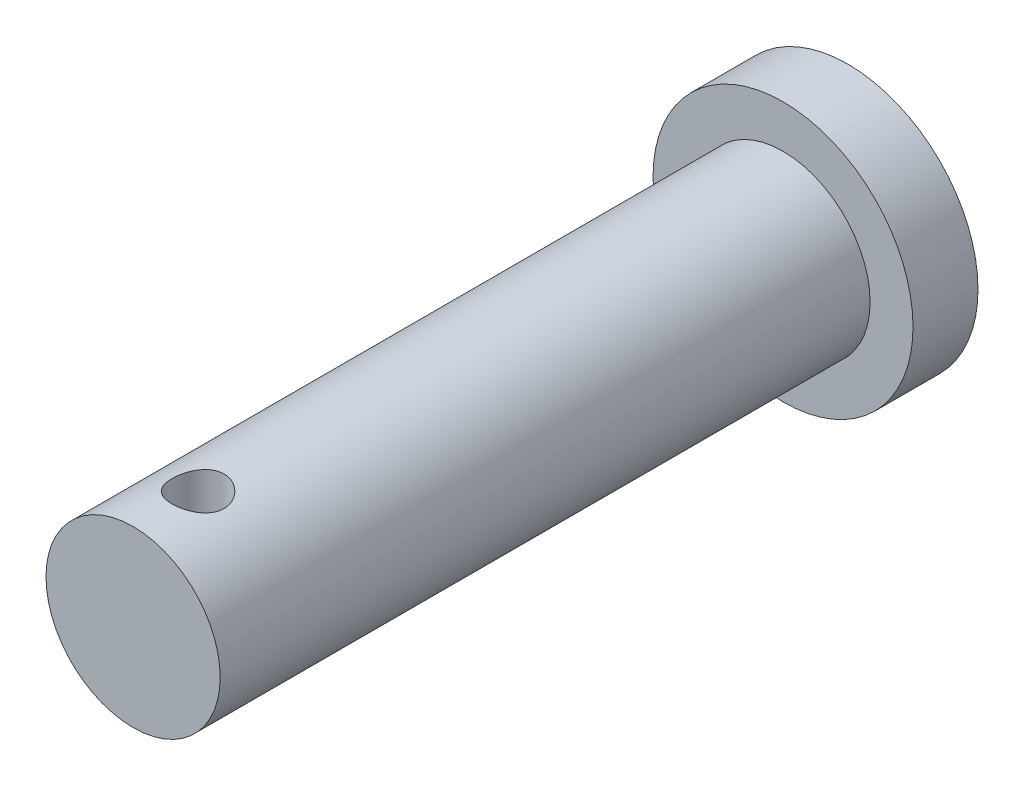
ISO-10303-21;
HEADER;
FILE_DESCRIPTION(('STEP AP214'),'2;1');
FILE_NAME('part.step','',(''),(''),'','','');
FILE_SCHEMA(('AUTOMOTIVE_DESIGN { 1 0 10303 214 1 1 1 1 }'));
ENDSEC;
DATA;
#1=APPLICATION_CONTEXT('core data for automotive mechanical design processes');
#2=APPLICATION_PROTOCOL_DEFINITION('international standard','automotive_design',2000,#1);
#3=PRODUCT_CONTEXT('',#1,'mechanical');
#4=PRODUCT('Part','Part','',(#3));
#5=PRODUCT_RELATED_PRODUCT_CATEGORY('part','',(#4));
#6=PRODUCT_DEFINITION_FORMATION('','',#4);
#7=PRODUCT_DEFINITION_CONTEXT('part definition',#1,'design');
#8=PRODUCT_DEFINITION('design','',#6,#7);
#9=PRODUCT_DEFINITION_SHAPE('','',#8);
#10=(LENGTH_UNIT() NAMED_UNIT(*) SI_UNIT(.MILLI.,.METRE.));
#11=(NAMED_UNIT(*) PLANE_ANGLE_UNIT() SI_UNIT($,.RADIAN.));
#12=(NAMED_UNIT(*) SI_UNIT($,.STERADIAN.) SOLID_ANGLE_UNIT());
#13=UNCERTAINTY_MEASURE_WITH_UNIT(LENGTH_MEASURE(1.E-05),#10,'distance_accuracy_value','');
#14=(GEOMETRIC_REPRESENTATION_CONTEXT(3) GLOBAL_UNCERTAINTY_ASSIGNED_CONTEXT((#13)) GLOBAL_UNIT_ASSIGNED_CONTEXT((#10,
#11,#12)) REPRESENTATION_CONTEXT('',''));
#15=CARTESIAN_POINT('',(0.,0.,0.));
#16=DIRECTION('',(0.,0.,1.));
#17=DIRECTION('',(1.,0.,0.));
#18=AXIS2_PLACEMENT_3D('',#15,#16,#17);
#19=CARTESIAN_POINT('',(0.,0.,55.));
#20=DIRECTION('',(0.,0.,-1.));
#21=DIRECTION('',(-1.,0.,0.));
#22=AXIS2_PLACEMENT_3D('',#19,#20,#21);
#23=CYLINDRICAL_SURFACE('',#22,6.7);
#24=CARTESIAN_POINT('',(0.,0.,55.));
#25=DIRECTION('',(0.,0.,1.));
#26=DIRECTION('',(1.,0.,0.));
#27=AXIS2_PLACEMENT_3D('',#24,#25,#26);
#28=CIRCLE('',#27,6.7);
#29=CARTESIAN_POINT('',(6.7,0.,55.));
#30=VERTEX_POINT('',#29);
#31=EDGE_CURVE('E50',#30,#30,#28,.T.);
#32=ORIENTED_EDGE('',*,*,#31,.F.);
#33=EDGE_LOOP('',(#32));
#34=FACE_BOUND('',#33,.T.);
#35=CARTESIAN_POINT('',(0.,0.,5.));
#36=DIRECTION('',(0.,0.,-1.));
#37=DIRECTION('',(-1.,0.,0.));
#38=AXIS2_PLACEMENT_3D('',#35,#36,#37);
#39=CIRCLE('',#38,6.7);
#40=CARTESIAN_POINT('',(-6.7,0.,5.));
#41=VERTEX_POINT('',#40);
#42=EDGE_CURVE('E10',#41,#41,#39,.T.);
#43=ORIENTED_EDGE('',*,*,#42,.F.);
#44=EDGE_LOOP('',(#43));
#45=FACE_BOUND('',#44,.T.);
#46=CARTESIAN_POINT('',(0.,-6.7,48.));
#47=CARTESIAN_POINT('',(0.109743361358819,-6.69999901435449,48.00000139815));
#48=CARTESIAN_POINT('',(0.219500873974357,-6.69727785917086,48.0090626676425));
#49=CARTESIAN_POINT('',(0.435821268100604,-6.68668840274672,48.04498334192));
#50=CARTESIAN_POINT('',(0.54238315918907,-6.67881852265205,48.071848206202));
#51=CARTESIAN_POINT('',(0.749160848463716,-6.65879423500564,48.1424003366706));
#52=CARTESIAN_POINT('',(0.849385705061713,-6.64664611410368,48.1860629281337));
#53=CARTESIAN_POINT('',(1.04109165908827,-6.61932898536908,48.2888703580089));
#54=CARTESIAN_POINT('',(1.1325716170567,-6.60415958465563,48.3480172102762));
#55=CARTESIAN_POINT('',(1.30679399162978,-6.57193622855964,48.48188765939));
#56=CARTESIAN_POINT('',(1.38925243957815,-6.55484394233304,48.5569715718118));
#57=CARTESIAN_POINT('',(1.54061411732459,-6.52093067960535,48.7198167287989));
#58=CARTESIAN_POINT('',(1.60951509351046,-6.50410974863661,48.8075800768257));
#59=CARTESIAN_POINT('',(1.73329508752743,-6.47223883737101,48.9956891671993));
#60=CARTESIAN_POINT('',(1.78782844079822,-6.45723652410896,49.096271198869));
#61=CARTESIAN_POINT('',(1.87909105818033,-6.43127391741259,49.3056983284035));
#62=CARTESIAN_POINT('',(1.91582454975421,-6.42031266437556,49.4145414571503));
#63=CARTESIAN_POINT('',(1.96942250711186,-6.40407252509909,49.6342143670852));
#64=CARTESIAN_POINT('',(1.98681009654374,-6.39864438114924,49.7449051822757));
#65=CARTESIAN_POINT('',(2.00285608148857,-6.393640941842,49.9677556611968));
#66=CARTESIAN_POINT('',(2.00151896423086,-6.39406424423099,50.0799149665789));
#67=CARTESIAN_POINT('',(1.98056458959883,-6.40058352381708,50.2982728193501));
#68=CARTESIAN_POINT('',(1.96160163408821,-6.40647644804714,50.4045412202519));
#69=CARTESIAN_POINT('',(1.90699057622309,-6.42294264775203,50.6123138878996));
#70=CARTESIAN_POINT('',(1.87134084195745,-6.43351638098884,50.7138176876149));
#71=CARTESIAN_POINT('',(1.78388388495136,-6.45831561688666,50.9107851521873));
#72=CARTESIAN_POINT('',(1.73186365844019,-6.47258879593137,51.0061479806742));
#73=CARTESIAN_POINT('',(1.61329044901396,-6.50315565265741,51.1870104723785));
#74=CARTESIAN_POINT('',(1.54673397423003,-6.51944981540837,51.2725077581596));
#75=CARTESIAN_POINT('',(1.39772347841684,-6.55304722393875,51.4349246007751));
#76=CARTESIAN_POINT('',(1.31472616230933,-6.57036434391284,51.5113436877708));
#77=CARTESIAN_POINT('',(1.13687871372721,-6.60345945676517,51.6492944648536));
#78=CARTESIAN_POINT('',(1.04202785044614,-6.61923735463889,51.7108252363444));
#79=CARTESIAN_POINT('',(0.842262554658344,-6.64761795940622,51.8175526002921));
#80=CARTESIAN_POINT('',(0.737286053483404,-6.66019910688464,51.8626391332474));
#81=CARTESIAN_POINT('',(0.52077775676212,-6.68061329202322,51.9343696176077));
#82=CARTESIAN_POINT('',(0.409247780014466,-6.68844764030789,51.9610186600217));
#83=CARTESIAN_POINT('',(0.187053836849445,-6.69827863557586,51.9942867338293));
#84=CARTESIAN_POINT('',(0.076500032664992,-6.70047290955619,52.0015841453804));
#85=CARTESIAN_POINT('',(-0.144259260354487,-6.69935577174841,51.9978418994359));
#86=CARTESIAN_POINT('',(-0.254464793255686,-6.69604508692854,51.9868046631586));
#87=CARTESIAN_POINT('',(-0.468845320229739,-6.68441932098258,51.9472553634519));
#88=CARTESIAN_POINT('',(-0.573100014213634,-6.67621759074487,51.9191388487106));
#89=CARTESIAN_POINT('',(-0.775390199297333,-6.65575803734013,51.8467042368495));
#90=CARTESIAN_POINT('',(-0.873424943904831,-6.64349972841274,51.8023841993509));
#91=CARTESIAN_POINT('',(-1.06299504601103,-6.6158472668663,51.6976563343578));
#92=CARTESIAN_POINT('',(-1.15432925198954,-6.6003875200001,51.6369021815925));
#93=CARTESIAN_POINT('',(-1.32573767112903,-6.56810776474197,51.5014521737486));
#94=CARTESIAN_POINT('',(-1.40580908065083,-6.55128741929277,51.4267528580428));
#95=CARTESIAN_POINT('',(-1.55540014036077,-6.51742513941161,51.2623464525456));
#96=CARTESIAN_POINT('',(-1.62443729290816,-6.50039695797792,51.1721965655278));
#97=CARTESIAN_POINT('',(-1.74643651734004,-6.46868973914826,50.9812215906884));
#98=CARTESIAN_POINT('',(-1.79939902761497,-6.45401063769292,50.8803967940959));
#99=CARTESIAN_POINT('',(-1.88738025081556,-6.42883293312705,50.6712664721194));
#100=CARTESIAN_POINT('',(-1.9224839672241,-6.41831458016538,50.5629992225536));
#101=CARTESIAN_POINT('',(-1.97385869716872,-6.40270385956844,50.3417183289477));
#102=CARTESIAN_POINT('',(-1.99013608322308,-6.39760965596106,50.2287063043959));
#103=CARTESIAN_POINT('',(-2.0029658351958,-6.39360363548539,50.0061527124078));
#104=CARTESIAN_POINT('',(-2.00030418711452,-6.3944454551483,49.8966602938886));
#105=CARTESIAN_POINT('',(-1.97720508955258,-6.40162503364949,49.6797597796582));
#106=CARTESIAN_POINT('',(-1.95676833875768,-6.40796257646741,49.5723516021913));
#107=CARTESIAN_POINT('',(-1.89920426613909,-6.42525509132359,49.363939371997));
#108=CARTESIAN_POINT('',(-1.86228309951482,-6.4361529294676,49.2628732882778));
#109=CARTESIAN_POINT('',(-1.77295860632938,-6.46132813255444,49.0682894691704));
#110=CARTESIAN_POINT('',(-1.7205523393202,-6.47560613925115,48.9747731717006));
#111=CARTESIAN_POINT('',(-1.59952912057487,-6.50657638983081,48.794291166151));
#112=CARTESIAN_POINT('',(-1.53039517029805,-6.5233371903636,48.7076839012072));
#113=CARTESIAN_POINT('',(-1.37881207245741,-6.55704939466007,48.5470450337386));
#114=CARTESIAN_POINT('',(-1.29635948205938,-6.5740008466497,48.4730166930137));
#115=CARTESIAN_POINT('',(-1.11761480582216,-6.60677053085957,48.3375102898597));
#116=CARTESIAN_POINT('',(-1.02099212501924,-6.62254197161737,48.2764558307476));
#117=CARTESIAN_POINT('',(-0.818382379424536,-6.65061520610284,48.1715445290257));
#118=CARTESIAN_POINT('',(-0.712399803993869,-6.66291865147025,48.1276794960194));
#119=CARTESIAN_POINT('',(-0.506100419135851,-6.68157083352247,48.0624105669634));
#120=CARTESIAN_POINT('',(-0.406438821554201,-6.68842498929753,48.0390695807004));
#121=CARTESIAN_POINT('',(-0.204521961333525,-6.6976396648136,48.0078649097227));
#122=CARTESIAN_POINT('',(-0.10226712508249,-6.70000091849868,47.9999986970986));
#123=CARTESIAN_POINT('',(0.,-6.7,48.));
#124=B_SPLINE_CURVE_WITH_KNOTS('',3,(#46,#47,#48,#49,#50,#51,#52,#53,#54,#55,#56,#57,#58,#59,
#60,#61,#62,#63,#64,#65,#66,#67,#68,#69,#70,#71,#72,#73,#74,#75,#76,#77,#78,#79,#80,#81,#82,#83,
#84,#85,#86,#87,#88,#89,#90,#91,#92,#93,#94,#95,#96,#97,#98,#99,#100,#101,#102,#103,#104,#105,
#106,#107,#108,#109,#110,#111,#112,#113,#114,#115,#116,#117,#118,#119,#120,#121,#122,#123),
.UNSPECIFIED.,.T.,.F.,(4,2,2,2,2,2,2,2,2,2,2,2,2,2,2,2,2,2,2,2,2,2,2,2,2,2,2,2,2,2,2,2,2,2,2,2,
2,2,4),(0.,0.32885446291896,0.657809816205378,0.986283790076348,1.31480050592643,
1.65173545532979,1.98872636505149,2.33320675681965,2.67760529443513,3.01244589828376,
3.3472062615768,3.67001573967276,3.99285679405367,4.32008541956659,4.64739273792107,
4.98822575334412,5.32907979251338,5.67217499194089,6.01517541715934,6.34598232115241,
6.67674554325451,7.00012590953024,7.32354501343518,7.65439703412549,7.98533126834957,
8.32815604163266,8.67097146449876,9.01213953466786,9.35319208914254,9.68017574503415,
10.0071465487638,10.3301380400965,10.6531909033726,10.9879082937643,11.322712346613,
11.6671737515337,12.0114708277658,12.3179722441952,12.6244235873731),.UNSPECIFIED.);
#125=CARTESIAN_POINT('',(0.,-6.7,48.));
#126=VERTEX_POINT('',#125);
#127=EDGE_CURVE('E59',#126,#126,#124,.T.);
#128=ORIENTED_EDGE('',*,*,#127,.F.);
#129=EDGE_LOOP('',(#128));
#130=FACE_BOUND('',#129,.T.);
#131=CARTESIAN_POINT('',(0.,6.7,48.));
#132=CARTESIAN_POINT('',(-0.109743361358819,6.69999901435449,48.00000139815));
#133=CARTESIAN_POINT('',(-0.219500873974357,6.69727785917086,48.0090626676425));
#134=CARTESIAN_POINT('',(-0.435821268100604,6.68668840274672,48.04498334192));
#135=CARTESIAN_POINT('',(-0.54238315918907,6.67881852265205,48.071848206202));
#136=CARTESIAN_POINT('',(-0.749160848463716,6.65879423500564,48.1424003366706));
#137=CARTESIAN_POINT('',(-0.849385705061713,6.64664611410368,48.1860629281337));
#138=CARTESIAN_POINT('',(-1.04109165908827,6.61932898536908,48.2888703580089));
#139=CARTESIAN_POINT('',(-1.1325716170567,6.60415958465563,48.3480172102762));
#140=CARTESIAN_POINT('',(-1.30679399162978,6.57193622855964,48.48188765939));
#141=CARTESIAN_POINT('',(-1.38925243957815,6.55484394233304,48.5569715718118));
#142=CARTESIAN_POINT('',(-1.54061411732459,6.52093067960535,48.7198167287989));
#143=CARTESIAN_POINT('',(-1.60951509351046,6.50410974863661,48.8075800768257));
#144=CARTESIAN_POINT('',(-1.73329508752743,6.47223883737101,48.9956891671993));
#145=CARTESIAN_POINT('',(-1.78782844079822,6.45723652410896,49.096271198869));
#146=CARTESIAN_POINT('',(-1.87909105818033,6.43127391741259,49.3056983284035));
#147=CARTESIAN_POINT('',(-1.91582454975421,6.42031266437556,49.4145414571503));
#148=CARTESIAN_POINT('',(-1.96942250711186,6.40407252509909,49.6342143670852));
#149=CARTESIAN_POINT('',(-1.98681009654374,6.39864438114924,49.7449051822757));
#150=CARTESIAN_POINT('',(-2.00285608148857,6.393640941842,49.9677556611968));
#151=CARTESIAN_POINT('',(-2.00151896423086,6.39406424423099,50.0799149665789));
#152=CARTESIAN_POINT('',(-1.98056458959883,6.40058352381708,50.2982728193501));
#153=CARTESIAN_POINT('',(-1.96160163408821,6.40647644804714,50.4045412202519));
#154=CARTESIAN_POINT('',(-1.90699057622309,6.42294264775203,50.6123138878996));
#155=CARTESIAN_POINT('',(-1.87134084195745,6.43351638098884,50.7138176876149));
#156=CARTESIAN_POINT('',(-1.78388388495136,6.45831561688666,50.9107851521873));
#157=CARTESIAN_POINT('',(-1.73186365844019,6.47258879593137,51.0061479806742));
#158=CARTESIAN_POINT('',(-1.61329044901396,6.50315565265741,51.1870104723785));
#159=CARTESIAN_POINT('',(-1.54673397423003,6.51944981540837,51.2725077581596));
#160=CARTESIAN_POINT('',(-1.39772347841684,6.55304722393875,51.4349246007751));
#161=CARTESIAN_POINT('',(-1.31472616230933,6.57036434391284,51.5113436877708));
#162=CARTESIAN_POINT('',(-1.13687871372721,6.60345945676517,51.6492944648536));
#163=CARTESIAN_POINT('',(-1.04202785044614,6.61923735463889,51.7108252363444));
#164=CARTESIAN_POINT('',(-0.842262554658344,6.64761795940622,51.8175526002921));
#165=CARTESIAN_POINT('',(-0.737286053483404,6.66019910688464,51.8626391332474));
#166=CARTESIAN_POINT('',(-0.52077775676212,6.68061329202322,51.9343696176077));
#167=CARTESIAN_POINT('',(-0.409247780014466,6.68844764030789,51.9610186600217));
#168=CARTESIAN_POINT('',(-0.187053836849445,6.69827863557586,51.9942867338293));
#169=CARTESIAN_POINT('',(-0.076500032664992,6.70047290955619,52.0015841453804));
#170=CARTESIAN_POINT('',(0.144259260354487,6.69935577174841,51.9978418994359));
#171=CARTESIAN_POINT('',(0.254464793255686,6.69604508692854,51.9868046631586));
#172=CARTESIAN_POINT('',(0.468845320229739,6.68441932098258,51.9472553634519));
#173=CARTESIAN_POINT('',(0.573100014213634,6.67621759074487,51.9191388487106));
#174=CARTESIAN_POINT('',(0.775390199297333,6.65575803734013,51.8467042368495));
#175=CARTESIAN_POINT('',(0.873424943904831,6.64349972841274,51.8023841993509));
#176=CARTESIAN_POINT('',(1.06299504601103,6.6158472668663,51.6976563343578));
#177=CARTESIAN_POINT('',(1.15432925198954,6.6003875200001,51.6369021815925));
#178=CARTESIAN_POINT('',(1.32573767112903,6.56810776474197,51.5014521737486));
#179=CARTESIAN_POINT('',(1.40580908065083,6.55128741929277,51.4267528580428));
#180=CARTESIAN_POINT('',(1.55540014036077,6.51742513941161,51.2623464525456));
#181=CARTESIAN_POINT('',(1.62443729290816,6.50039695797792,51.1721965655278));
#182=CARTESIAN_POINT('',(1.74643651734004,6.46868973914826,50.9812215906884));
#183=CARTESIAN_POINT('',(1.79939902761497,6.45401063769292,50.8803967940959));
#184=CARTESIAN_POINT('',(1.88738025081556,6.42883293312705,50.6712664721194));
#185=CARTESIAN_POINT('',(1.9224839672241,6.41831458016538,50.5629992225536));
#186=CARTESIAN_POINT('',(1.97385869716872,6.40270385956844,50.3417183289477));
#187=CARTESIAN_POINT('',(1.99013608322308,6.39760965596106,50.2287063043959));
#188=CARTESIAN_POINT('',(2.0029658351958,6.39360363548539,50.0061527124078));
#189=CARTESIAN_POINT('',(2.00030418711452,6.3944454551483,49.8966602938886));
#190=CARTESIAN_POINT('',(1.97720508955258,6.40162503364949,49.6797597796582));
#191=CARTESIAN_POINT('',(1.95676833875768,6.40796257646741,49.5723516021913));
#192=CARTESIAN_POINT('',(1.89920426613909,6.42525509132359,49.363939371997));
#193=CARTESIAN_POINT('',(1.86228309951482,6.4361529294676,49.2628732882778));
#194=CARTESIAN_POINT('',(1.77295860632938,6.46132813255444,49.0682894691704));
#195=CARTESIAN_POINT('',(1.7205523393202,6.47560613925115,48.9747731717006));
#196=CARTESIAN_POINT('',(1.59952912057487,6.50657638983081,48.794291166151));
#197=CARTESIAN_POINT('',(1.53039517029805,6.5233371903636,48.7076839012072));
#198=CARTESIAN_POINT('',(1.37881207245741,6.55704939466007,48.5470450337386));
#199=CARTESIAN_POINT('',(1.29635948205938,6.5740008466497,48.4730166930137));
#200=CARTESIAN_POINT('',(1.11761480582216,6.60677053085957,48.3375102898597));
#201=CARTESIAN_POINT('',(1.02099212501924,6.62254197161737,48.2764558307476));
#202=CARTESIAN_POINT('',(0.818382379424536,6.65061520610284,48.1715445290257));
#203=CARTESIAN_POINT('',(0.712399803993869,6.66291865147025,48.1276794960194));
#204=CARTESIAN_POINT('',(0.506100419135851,6.68157083352247,48.0624105669634));
#205=CARTESIAN_POINT('',(0.406438821554201,6.68842498929753,48.0390695807004));
#206=CARTESIAN_POINT('',(0.204521961333525,6.6976396648136,48.0078649097227));
#207=CARTESIAN_POINT('',(0.10226712508249,6.70000091849868,47.9999986970986));
#208=CARTESIAN_POINT('',(0.,6.7,48.));
#209=B_SPLINE_CURVE_WITH_KNOTS('',3,(#131,#132,#133,#134,#135,#136,#137,#138,#139,#140,#141,
#142,#143,#144,#145,#146,#147,#148,#149,#150,#151,#152,#153,#154,#155,#156,#157,#158,#159,#160,
#161,#162,#163,#164,#165,#166,#167,#168,#169,#170,#171,#172,#173,#174,#175,#176,#177,#178,#179,
#180,#181,#182,#183,#184,#185,#186,#187,#188,#189,#190,#191,#192,#193,#194,#195,#196,#197,#198,
#199,#200,#201,#202,#203,#204,#205,#206,#207,#208),.UNSPECIFIED.,.T.,.F.,(4,2,2,2,2,2,2,2,2,2,2,
2,2,2,2,2,2,2,2,2,2,2,2,2,2,2,2,2,2,2,2,2,2,2,2,2,2,2,4),(0.,0.32885446291896,0.657809816205378,
0.986283790076348,1.31480050592643,1.65173545532979,1.98872636505149,2.33320675681965,
2.67760529443513,3.01244589828376,3.3472062615768,3.67001573967276,3.99285679405367,
4.32008541956659,4.64739273792107,4.98822575334412,5.32907979251338,5.67217499194089,
6.01517541715934,6.34598232115241,6.67674554325451,7.00012590953024,7.32354501343518,
7.65439703412549,7.98533126834957,8.32815604163266,8.67097146449876,9.01213953466786,
9.35319208914254,9.68017574503415,10.0071465487638,10.3301380400965,10.6531909033726,
10.9879082937643,11.322712346613,11.6671737515337,12.0114708277658,12.3179722441952,
12.6244235873731),.UNSPECIFIED.);
#210=CARTESIAN_POINT('',(0.,6.7,48.));
#211=VERTEX_POINT('',#210);
#212=EDGE_CURVE('E41',#211,#211,#209,.T.);
#213=ORIENTED_EDGE('',*,*,#212,.F.);
#214=EDGE_LOOP('',(#213));
#215=FACE_BOUND('',#214,.T.);
#216=ADVANCED_FACE('F37',(#34,#45,#130,#215),#23,.T.);
#217=CARTESIAN_POINT('',(0.,0.,55.));
#218=DIRECTION('',(0.,0.,1.));
#219=DIRECTION('',(1.,0.,0.));
#220=AXIS2_PLACEMENT_3D('',#217,#218,#219);
#221=PLANE('',#220);
#222=ORIENTED_EDGE('',*,*,#31,.T.);
#223=EDGE_LOOP('',(#222));
#224=FACE_BOUND('',#223,.T.);
#225=ADVANCED_FACE('F78',(#224),#221,.T.);
#226=CARTESIAN_POINT('',(0.,0.,5.));
#227=DIRECTION('',(0.,0.,-1.));
#228=DIRECTION('',(-1.,0.,0.));
#229=AXIS2_PLACEMENT_3D('',#226,#227,#228);
#230=CYLINDRICAL_SURFACE('',#229,10.);
#231=CARTESIAN_POINT('',(0.,0.,5.));
#232=DIRECTION('',(0.,0.,-1.));
#233=DIRECTION('',(-1.,0.,0.));
#234=AXIS2_PLACEMENT_3D('',#231,#232,#233);
#235=CIRCLE('',#234,10.);
#236=CARTESIAN_POINT('',(-10.,0.,5.));
#237=VERTEX_POINT('',#236);
#238=EDGE_CURVE('E56',#237,#237,#235,.T.);
#239=ORIENTED_EDGE('',*,*,#238,.T.);
#240=EDGE_LOOP('',(#239));
#241=FACE_BOUND('',#240,.T.);
#242=CARTESIAN_POINT('',(0.,0.,0.));
#243=DIRECTION('',(0.,0.,-1.));
#244=DIRECTION('',(-1.,0.,0.));
#245=AXIS2_PLACEMENT_3D('',#242,#243,#244);
#246=CIRCLE('',#245,10.);
#247=CARTESIAN_POINT('',(-10.,0.,0.));
#248=VERTEX_POINT('',#247);
#249=EDGE_CURVE('E100',#248,#248,#246,.T.);
#250=ORIENTED_EDGE('',*,*,#249,.F.);
#251=EDGE_LOOP('',(#250));
#252=FACE_BOUND('',#251,.T.);
#253=ADVANCED_FACE('F75',(#241,#252),#230,.T.);
#254=CARTESIAN_POINT('',(0.,0.,5.));
#255=DIRECTION('',(0.,0.,-1.));
#256=DIRECTION('',(-1.,0.,0.));
#257=AXIS2_PLACEMENT_3D('',#254,#255,#256);
#258=PLANE('',#257);
#259=ORIENTED_EDGE('',*,*,#42,.T.);
#260=EDGE_LOOP('',(#259));
#261=FACE_BOUND('',#260,.T.);
#262=ORIENTED_EDGE('',*,*,#238,.F.);
#263=EDGE_LOOP('',(#262));
#264=FACE_BOUND('',#263,.T.);
#265=ADVANCED_FACE('F71',(#261,#264),#258,.F.);
#266=CARTESIAN_POINT('',(0.,0.,0.));
#267=DIRECTION('',(0.,0.,1.));
#268=DIRECTION('',(1.,0.,0.));
#269=AXIS2_PLACEMENT_3D('',#266,#267,#268);
#270=PLANE('',#269);
#271=ORIENTED_EDGE('',*,*,#249,.T.);
#272=EDGE_LOOP('',(#271));
#273=FACE_BOUND('',#272,.T.);
#274=ADVANCED_FACE('F69',(#273),#270,.F.);
#275=CARTESIAN_POINT('',(0.,10.,50.));
#276=DIRECTION('',(0.,-1.,0.));
#277=DIRECTION('',(0.,0.,-1.));
#278=AXIS2_PLACEMENT_3D('',#275,#276,#277);
#279=CYLINDRICAL_SURFACE('',#278,2.);
#280=ORIENTED_EDGE('',*,*,#127,.T.);
#281=EDGE_LOOP('',(#280));
#282=FACE_BOUND('',#281,.T.);
#283=ORIENTED_EDGE('',*,*,#212,.T.);
#284=EDGE_LOOP('',(#283));
#285=FACE_BOUND('',#284,.T.);
#286=ADVANCED_FACE('F65',(#282,#285),#279,.F.);
#287=CLOSED_SHELL('',(#216,#225,#253,#265,#274,#286));
#288=MANIFOLD_SOLID_BREP('B2',#287);
#289=ADVANCED_BREP_SHAPE_REPRESENTATION('',(#18,#288),#14);
#290=SHAPE_DEFINITION_REPRESENTATION(#9,#289);
ENDSEC;
END-ISO-10303-21;
